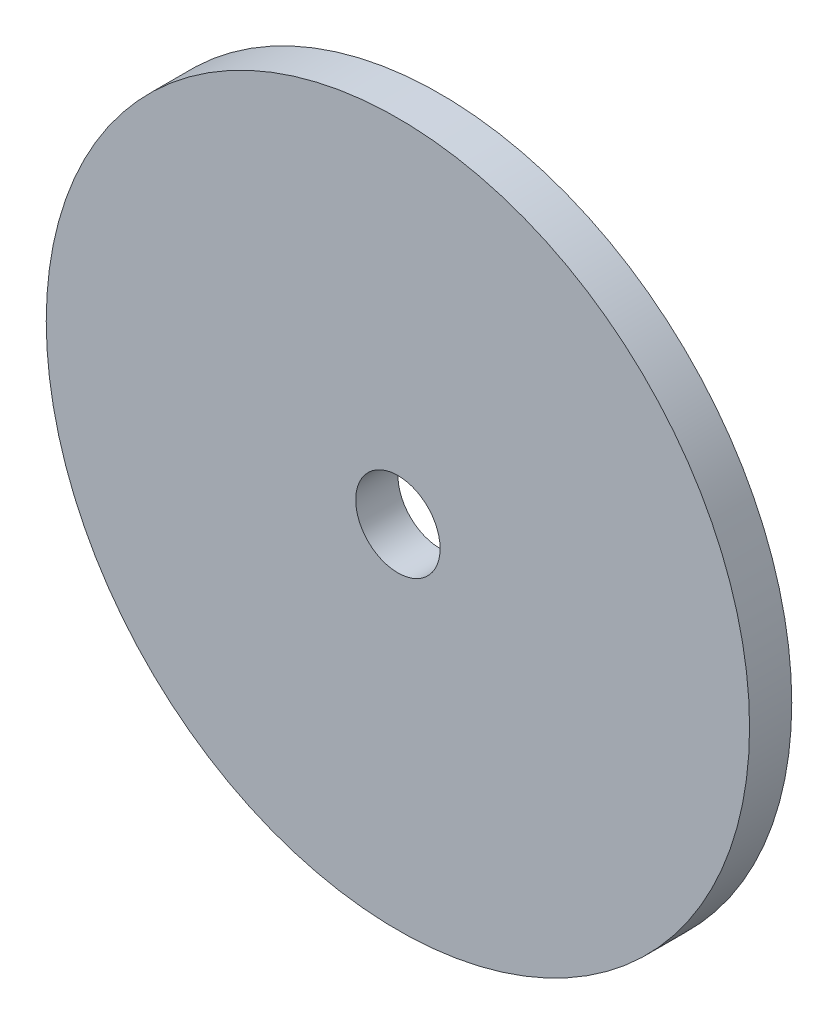
ISO-10303-21;
HEADER;
FILE_DESCRIPTION(('STEP AP214'),'2;1');
FILE_NAME('part.step','',(''),(''),'','','');
FILE_SCHEMA(('AUTOMOTIVE_DESIGN { 1 0 10303 214 1 1 1 1 }'));
ENDSEC;
DATA;
#1=APPLICATION_CONTEXT('core data for automotive mechanical design processes');
#2=APPLICATION_PROTOCOL_DEFINITION('international standard','automotive_design',2000,#1);
#3=PRODUCT_CONTEXT('',#1,'mechanical');
#4=PRODUCT('Part','Part','',(#3));
#5=PRODUCT_RELATED_PRODUCT_CATEGORY('part','',(#4));
#6=PRODUCT_DEFINITION_FORMATION('','',#4);
#7=PRODUCT_DEFINITION_CONTEXT('part definition',#1,'design');
#8=PRODUCT_DEFINITION('design','',#6,#7);
#9=PRODUCT_DEFINITION_SHAPE('','',#8);
#10=(LENGTH_UNIT() NAMED_UNIT(*) SI_UNIT(.MILLI.,.METRE.));
#11=(NAMED_UNIT(*) PLANE_ANGLE_UNIT() SI_UNIT($,.RADIAN.));
#12=(NAMED_UNIT(*) SI_UNIT($,.STERADIAN.) SOLID_ANGLE_UNIT());
#13=UNCERTAINTY_MEASURE_WITH_UNIT(LENGTH_MEASURE(1.E-05),#10,'distance_accuracy_value','');
#14=(GEOMETRIC_REPRESENTATION_CONTEXT(3) GLOBAL_UNCERTAINTY_ASSIGNED_CONTEXT((#13)) GLOBAL_UNIT_ASSIGNED_CONTEXT((#10,
#11,#12)) REPRESENTATION_CONTEXT('',''));
#15=CARTESIAN_POINT('',(0.,0.,0.));
#16=DIRECTION('',(0.,0.,1.));
#17=DIRECTION('',(1.,0.,0.));
#18=AXIS2_PLACEMENT_3D('',#15,#16,#17);
#19=CARTESIAN_POINT('',(0.,0.,6.));
#20=DIRECTION('',(0.,0.,1.));
#21=DIRECTION('',(1.,0.,0.));
#22=AXIS2_PLACEMENT_3D('',#19,#20,#21);
#23=PLANE('',#22);
#24=CARTESIAN_POINT('',(0.,0.,6.));
#25=DIRECTION('',(0.,0.,1.));
#26=DIRECTION('',(1.,0.,0.));
#27=AXIS2_PLACEMENT_3D('',#24,#25,#26);
#28=CIRCLE('',#27,50.);
#29=CARTESIAN_POINT('',(50.,0.,6.));
#30=VERTEX_POINT('',#29);
#31=EDGE_CURVE('E10',#30,#30,#28,.T.);
#32=ORIENTED_EDGE('',*,*,#31,.T.);
#33=EDGE_LOOP('',(#32));
#34=FACE_BOUND('',#33,.T.);
#35=CARTESIAN_POINT('',(0.,0.,6.));
#36=DIRECTION('',(0.,0.,1.));
#37=DIRECTION('',(1.,0.,0.));
#38=AXIS2_PLACEMENT_3D('',#35,#36,#37);
#39=CIRCLE('',#38,6.);
#40=CARTESIAN_POINT('',(6.,0.,6.));
#41=VERTEX_POINT('',#40);
#42=EDGE_CURVE('E42',#41,#41,#39,.T.);
#43=ORIENTED_EDGE('',*,*,#42,.F.);
#44=EDGE_LOOP('',(#43));
#45=FACE_BOUND('',#44,.T.);
#46=ADVANCED_FACE('F31',(#34,#45),#23,.T.);
#47=CARTESIAN_POINT('',(0.,0.,0.));
#48=DIRECTION('',(0.,0.,1.));
#49=DIRECTION('',(1.,0.,0.));
#50=AXIS2_PLACEMENT_3D('',#47,#48,#49);
#51=PLANE('',#50);
#52=CARTESIAN_POINT('',(0.,0.,0.));
#53=DIRECTION('',(0.,0.,1.));
#54=DIRECTION('',(1.,0.,0.));
#55=AXIS2_PLACEMENT_3D('',#52,#53,#54);
#56=CIRCLE('',#55,50.);
#57=CARTESIAN_POINT('',(50.,0.,0.));
#58=VERTEX_POINT('',#57);
#59=EDGE_CURVE('E35',#58,#58,#56,.T.);
#60=ORIENTED_EDGE('',*,*,#59,.F.);
#61=EDGE_LOOP('',(#60));
#62=FACE_BOUND('',#61,.T.);
#63=CARTESIAN_POINT('',(0.,0.,0.));
#64=DIRECTION('',(0.,0.,1.));
#65=DIRECTION('',(1.,0.,0.));
#66=AXIS2_PLACEMENT_3D('',#63,#64,#65);
#67=CIRCLE('',#66,6.);
#68=CARTESIAN_POINT('',(6.,0.,0.));
#69=VERTEX_POINT('',#68);
#70=EDGE_CURVE('E44',#69,#69,#67,.T.);
#71=ORIENTED_EDGE('',*,*,#70,.T.);
#72=EDGE_LOOP('',(#71));
#73=FACE_BOUND('',#72,.T.);
#74=ADVANCED_FACE('F54',(#62,#73),#51,.F.);
#75=CARTESIAN_POINT('',(0.,0.,6.));
#76=DIRECTION('',(0.,0.,-1.));
#77=DIRECTION('',(-1.,0.,0.));
#78=AXIS2_PLACEMENT_3D('',#75,#76,#77);
#79=CYLINDRICAL_SURFACE('',#78,50.);
#80=ORIENTED_EDGE('',*,*,#31,.F.);
#81=EDGE_LOOP('',(#80));
#82=FACE_BOUND('',#81,.T.);
#83=ORIENTED_EDGE('',*,*,#59,.T.);
#84=EDGE_LOOP('',(#83));
#85=FACE_BOUND('',#84,.T.);
#86=ADVANCED_FACE('F33',(#82,#85),#79,.T.);
#87=CARTESIAN_POINT('',(0.,0.,6.));
#88=DIRECTION('',(0.,0.,-1.));
#89=DIRECTION('',(-1.,0.,0.));
#90=AXIS2_PLACEMENT_3D('',#87,#88,#89);
#91=CYLINDRICAL_SURFACE('',#90,6.);
#92=ORIENTED_EDGE('',*,*,#42,.T.);
#93=EDGE_LOOP('',(#92));
#94=FACE_BOUND('',#93,.T.);
#95=ORIENTED_EDGE('',*,*,#70,.F.);
#96=EDGE_LOOP('',(#95));
#97=FACE_BOUND('',#96,.T.);
#98=ADVANCED_FACE('F50',(#94,#97),#91,.F.);
#99=CLOSED_SHELL('',(#46,#74,#86,#98));
#100=MANIFOLD_SOLID_BREP('B2',#99);
#101=ADVANCED_BREP_SHAPE_REPRESENTATION('',(#18,#100),#14);
#102=SHAPE_DEFINITION_REPRESENTATION(#9,#101);
ENDSEC;
END-ISO-10303-21;
